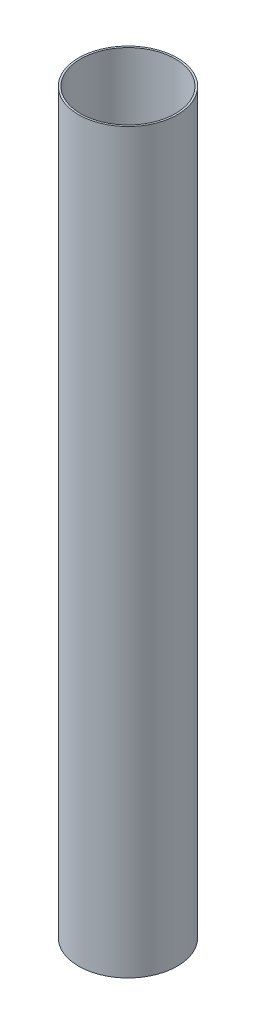
ISO-10303-21;
HEADER;
FILE_DESCRIPTION(('STEP AP214'),'2;1');
FILE_NAME('part.step','',(''),(''),'','','');
FILE_SCHEMA(('AUTOMOTIVE_DESIGN { 1 0 10303 214 1 1 1 1 }'));
ENDSEC;
DATA;
#1=APPLICATION_CONTEXT('core data for automotive mechanical design processes');
#2=APPLICATION_PROTOCOL_DEFINITION('international standard','automotive_design',2000,#1);
#3=PRODUCT_CONTEXT('',#1,'mechanical');
#4=PRODUCT('Part','Part','',(#3));
#5=PRODUCT_RELATED_PRODUCT_CATEGORY('part','',(#4));
#6=PRODUCT_DEFINITION_FORMATION('','',#4);
#7=PRODUCT_DEFINITION_CONTEXT('part definition',#1,'design');
#8=PRODUCT_DEFINITION('design','',#6,#7);
#9=PRODUCT_DEFINITION_SHAPE('','',#8);
#10=(LENGTH_UNIT() NAMED_UNIT(*) SI_UNIT(.MILLI.,.METRE.));
#11=(NAMED_UNIT(*) PLANE_ANGLE_UNIT() SI_UNIT($,.RADIAN.));
#12=(NAMED_UNIT(*) SI_UNIT($,.STERADIAN.) SOLID_ANGLE_UNIT());
#13=UNCERTAINTY_MEASURE_WITH_UNIT(LENGTH_MEASURE(1.E-05),#10,'distance_accuracy_value','');
#14=(GEOMETRIC_REPRESENTATION_CONTEXT(3) GLOBAL_UNCERTAINTY_ASSIGNED_CONTEXT((#13)) GLOBAL_UNIT_ASSIGNED_CONTEXT((#10,
#11,#12)) REPRESENTATION_CONTEXT('',''));
#15=CARTESIAN_POINT('',(0.,0.,0.));
#16=DIRECTION('',(0.,0.,1.));
#17=DIRECTION('',(1.,0.,0.));
#18=AXIS2_PLACEMENT_3D('',#15,#16,#17);
#19=CARTESIAN_POINT('',(0.,592.36,0.));
#20=DIRECTION('',(0.,1.,0.));
#21=DIRECTION('',(0.,0.,1.));
#22=AXIS2_PLACEMENT_3D('',#19,#20,#21);
#23=PLANE('',#22);
#24=CARTESIAN_POINT('',(0.,592.36,0.));
#25=DIRECTION('',(0.,1.,0.));
#26=DIRECTION('',(0.,0.,1.));
#27=AXIS2_PLACEMENT_3D('',#24,#25,#26);
#28=CIRCLE('',#27,39.624);
#29=CARTESIAN_POINT('',(0.,592.36,39.624));
#30=VERTEX_POINT('',#29);
#31=EDGE_CURVE('E10',#30,#30,#28,.T.);
#32=ORIENTED_EDGE('',*,*,#31,.T.);
#33=EDGE_LOOP('',(#32));
#34=FACE_BOUND('',#33,.T.);
#35=CARTESIAN_POINT('',(0.,592.36,0.));
#36=DIRECTION('',(0.,1.,0.));
#37=DIRECTION('',(0.,0.,1.));
#38=AXIS2_PLACEMENT_3D('',#35,#36,#37);
#39=CIRCLE('',#38,38.1);
#40=CARTESIAN_POINT('',(0.,592.36,38.1));
#41=VERTEX_POINT('',#40);
#42=EDGE_CURVE('E48',#41,#41,#39,.T.);
#43=ORIENTED_EDGE('',*,*,#42,.F.);
#44=EDGE_LOOP('',(#43));
#45=FACE_BOUND('',#44,.T.);
#46=ADVANCED_FACE('F37',(#34,#45),#23,.T.);
#47=CARTESIAN_POINT('',(0.,0.,0.));
#48=DIRECTION('',(0.,1.,0.));
#49=DIRECTION('',(0.,0.,1.));
#50=AXIS2_PLACEMENT_3D('',#47,#48,#49);
#51=PLANE('',#50);
#52=CARTESIAN_POINT('',(0.,0.,0.));
#53=DIRECTION('',(0.,1.,0.));
#54=DIRECTION('',(0.,0.,1.));
#55=AXIS2_PLACEMENT_3D('',#52,#53,#54);
#56=CIRCLE('',#55,39.624);
#57=CARTESIAN_POINT('',(0.,0.,39.624));
#58=VERTEX_POINT('',#57);
#59=EDGE_CURVE('E41',#58,#58,#56,.T.);
#60=ORIENTED_EDGE('',*,*,#59,.F.);
#61=EDGE_LOOP('',(#60));
#62=FACE_BOUND('',#61,.T.);
#63=CARTESIAN_POINT('',(0.,0.,0.));
#64=DIRECTION('',(0.,1.,0.));
#65=DIRECTION('',(0.,0.,1.));
#66=AXIS2_PLACEMENT_3D('',#63,#64,#65);
#67=CIRCLE('',#66,38.1);
#68=CARTESIAN_POINT('',(0.,0.,38.1));
#69=VERTEX_POINT('',#68);
#70=EDGE_CURVE('E50',#69,#69,#67,.T.);
#71=ORIENTED_EDGE('',*,*,#70,.T.);
#72=EDGE_LOOP('',(#71));
#73=FACE_BOUND('',#72,.T.);
#74=ADVANCED_FACE('F60',(#62,#73),#51,.F.);
#75=CARTESIAN_POINT('',(0.,592.36,0.));
#76=DIRECTION('',(0.,-1.,0.));
#77=DIRECTION('',(0.,0.,-1.));
#78=AXIS2_PLACEMENT_3D('',#75,#76,#77);
#79=CYLINDRICAL_SURFACE('',#78,39.624);
#80=ORIENTED_EDGE('',*,*,#31,.F.);
#81=EDGE_LOOP('',(#80));
#82=FACE_BOUND('',#81,.T.);
#83=ORIENTED_EDGE('',*,*,#59,.T.);
#84=EDGE_LOOP('',(#83));
#85=FACE_BOUND('',#84,.T.);
#86=ADVANCED_FACE('F39',(#82,#85),#79,.T.);
#87=CARTESIAN_POINT('',(0.,592.36,0.));
#88=DIRECTION('',(0.,-1.,0.));
#89=DIRECTION('',(0.,0.,-1.));
#90=AXIS2_PLACEMENT_3D('',#87,#88,#89);
#91=CYLINDRICAL_SURFACE('',#90,38.1);
#92=ORIENTED_EDGE('',*,*,#42,.T.);
#93=EDGE_LOOP('',(#92));
#94=FACE_BOUND('',#93,.T.);
#95=ORIENTED_EDGE('',*,*,#70,.F.);
#96=EDGE_LOOP('',(#95));
#97=FACE_BOUND('',#96,.T.);
#98=ADVANCED_FACE('F56',(#94,#97),#91,.F.);
#99=CLOSED_SHELL('',(#46,#74,#86,#98));
#100=MANIFOLD_SOLID_BREP('B2',#99);
#101=ADVANCED_BREP_SHAPE_REPRESENTATION('',(#18,#100),#14);
#102=SHAPE_DEFINITION_REPRESENTATION(#9,#101);
ENDSEC;
END-ISO-10303-21;
